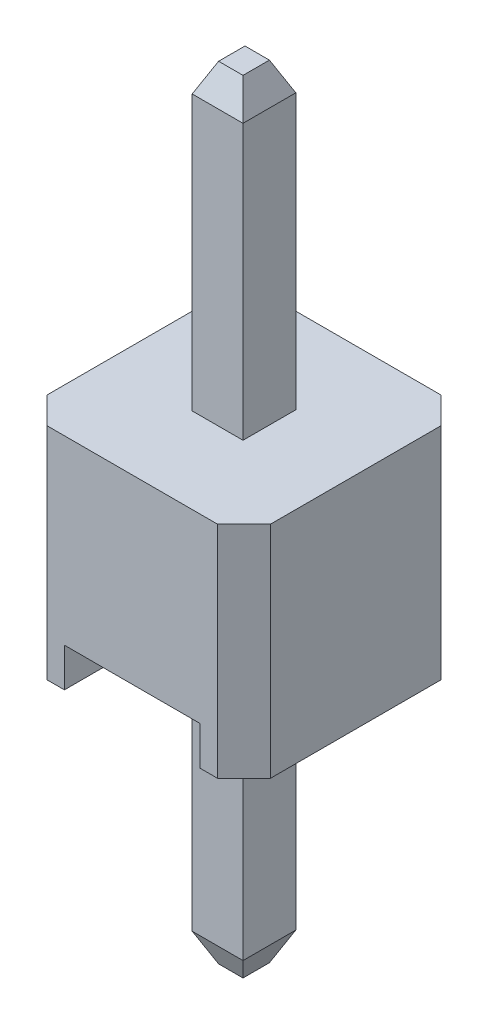
ISO-10303-21;
HEADER;
FILE_DESCRIPTION(('STEP AP214'),'2;1');
FILE_NAME('part.step','',(''),(''),'','','');
FILE_SCHEMA(('AUTOMOTIVE_DESIGN { 1 0 10303 214 1 1 1 1 }'));
ENDSEC;
DATA;
#1=APPLICATION_CONTEXT('core data for automotive mechanical design processes');
#2=APPLICATION_PROTOCOL_DEFINITION('international standard','automotive_design',2000,#1);
#3=PRODUCT_CONTEXT('',#1,'mechanical');
#4=PRODUCT('Part','Part','',(#3));
#5=PRODUCT_RELATED_PRODUCT_CATEGORY('part','',(#4));
#6=PRODUCT_DEFINITION_FORMATION('','',#4);
#7=PRODUCT_DEFINITION_CONTEXT('part definition',#1,'design');
#8=PRODUCT_DEFINITION('design','',#6,#7);
#9=PRODUCT_DEFINITION_SHAPE('','',#8);
#10=(LENGTH_UNIT() NAMED_UNIT(*) SI_UNIT(.MILLI.,.METRE.));
#11=(NAMED_UNIT(*) PLANE_ANGLE_UNIT() SI_UNIT($,.RADIAN.));
#12=(NAMED_UNIT(*) SI_UNIT($,.STERADIAN.) SOLID_ANGLE_UNIT());
#13=UNCERTAINTY_MEASURE_WITH_UNIT(LENGTH_MEASURE(1.E-05),#10,'distance_accuracy_value','');
#14=(GEOMETRIC_REPRESENTATION_CONTEXT(3) GLOBAL_UNCERTAINTY_ASSIGNED_CONTEXT((#13)) GLOBAL_UNIT_ASSIGNED_CONTEXT((#10,
#11,#12)) REPRESENTATION_CONTEXT('',''));
#15=CARTESIAN_POINT('',(0.,0.,0.));
#16=DIRECTION('',(0.,0.,1.));
#17=DIRECTION('',(1.,0.,0.));
#18=AXIS2_PLACEMENT_3D('',#15,#16,#17);
#19=CARTESIAN_POINT('',(-0.970000000000004,0.,-1.27));
#20=DIRECTION('',(0.,1.,0.));
#21=DIRECTION('',(0.,0.,1.));
#22=AXIS2_PLACEMENT_3D('',#19,#20,#21);
#23=PLANE('',#22);
#24=DIRECTION('',(1.,0.,0.));
#25=VECTOR('',#24,1.);
#26=CARTESIAN_POINT('',(0.3,0.,0.));
#27=LINE('',#26,#25);
#28=CARTESIAN_POINT('',(2.04,0.,0.));
#29=VERTEX_POINT('',#28);
#30=CARTESIAN_POINT('',(2.24,0.,0.));
#31=VERTEX_POINT('',#30);
#32=EDGE_CURVE('E282',#29,#31,#27,.T.);
#33=ORIENTED_EDGE('',*,*,#32,.F.);
#34=DIRECTION('',(0.,0.,1.));
#35=VECTOR('',#34,1.);
#36=CARTESIAN_POINT('',(2.04,0.,0.));
#37=LINE('',#36,#35);
#38=CARTESIAN_POINT('',(2.04,0.,-2.54));
#39=VERTEX_POINT('',#38);
#40=EDGE_CURVE('E236',#39,#29,#37,.T.);
#41=ORIENTED_EDGE('',*,*,#40,.F.);
#42=DIRECTION('',(-1.,0.,0.));
#43=VECTOR('',#42,1.);
#44=CARTESIAN_POINT('',(2.24,0.,-2.54));
#45=LINE('',#44,#43);
#46=CARTESIAN_POINT('',(2.24,0.,-2.54));
#47=VERTEX_POINT('',#46);
#48=EDGE_CURVE('E261',#47,#39,#45,.T.);
#49=ORIENTED_EDGE('',*,*,#48,.F.);
#50=DIRECTION('',(-0.707106781186547,0.,-0.707106781186549));
#51=VECTOR('',#50,1.);
#52=CARTESIAN_POINT('',(2.54,0.,-2.24));
#53=LINE('',#52,#51);
#54=CARTESIAN_POINT('',(2.54,0.,-2.24));
#55=VERTEX_POINT('',#54);
#56=EDGE_CURVE('E290',#55,#47,#53,.T.);
#57=ORIENTED_EDGE('',*,*,#56,.F.);
#58=DIRECTION('',(0.,0.,-1.));
#59=VECTOR('',#58,1.);
#60=CARTESIAN_POINT('',(2.54,0.,-0.3));
#61=LINE('',#60,#59);
#62=CARTESIAN_POINT('',(2.54,0.,-0.3));
#63=VERTEX_POINT('',#62);
#64=EDGE_CURVE('E288',#63,#55,#61,.T.);
#65=ORIENTED_EDGE('',*,*,#64,.F.);
#66=DIRECTION('',(0.707106781186546,0.,-0.707106781186549));
#67=VECTOR('',#66,1.);
#68=CARTESIAN_POINT('',(2.24,0.,0.));
#69=LINE('',#68,#67);
#70=EDGE_CURVE('E286',#31,#63,#69,.T.);
#71=ORIENTED_EDGE('',*,*,#70,.F.);
#72=EDGE_LOOP('',(#33,#41,#49,#57,#65,#71));
#73=FACE_BOUND('',#72,.T.);
#74=ADVANCED_FACE('F32',(#73),#23,.F.);
#75=CARTESIAN_POINT('',(0.3,2.5,-2.54));
#76=DIRECTION('',(0.707106781186546,0.,0.707106781186549));
#77=DIRECTION('',(0.707106781186549,0.,-0.707106781186546));
#78=AXIS2_PLACEMENT_3D('',#75,#76,#77);
#79=PLANE('',#78);
#80=DIRECTION('',(-0.707106781186549,0.,0.707106781186546));
#81=VECTOR('',#80,1.);
#82=CARTESIAN_POINT('',(0.3,0.,-2.54));
#83=LINE('',#82,#81);
#84=CARTESIAN_POINT('',(0.3,0.,-2.54));
#85=VERTEX_POINT('',#84);
#86=CARTESIAN_POINT('',(0.,0.,-2.24));
#87=VERTEX_POINT('',#86);
#88=EDGE_CURVE('E250',#85,#87,#83,.T.);
#89=ORIENTED_EDGE('',*,*,#88,.T.);
#90=DIRECTION('',(0.,-1.,0.));
#91=VECTOR('',#90,1.);
#92=CARTESIAN_POINT('',(0.,2.5,-2.24));
#93=LINE('',#92,#91);
#94=CARTESIAN_POINT('',(0.,2.5,-2.24));
#95=VERTEX_POINT('',#94);
#96=EDGE_CURVE('E315',#95,#87,#93,.T.);
#97=ORIENTED_EDGE('',*,*,#96,.F.);
#98=DIRECTION('',(-0.707106781186549,0.,0.707106781186546));
#99=VECTOR('',#98,1.);
#100=CARTESIAN_POINT('',(0.3,2.5,-2.54));
#101=LINE('',#100,#99);
#102=CARTESIAN_POINT('',(0.3,2.5,-2.54));
#103=VERTEX_POINT('',#102);
#104=EDGE_CURVE('E257',#103,#95,#101,.T.);
#105=ORIENTED_EDGE('',*,*,#104,.F.);
#106=DIRECTION('',(0.,-1.,0.));
#107=VECTOR('',#106,1.);
#108=CARTESIAN_POINT('',(0.3,2.5,-2.54));
#109=LINE('',#108,#107);
#110=EDGE_CURVE('E275',#103,#85,#109,.T.);
#111=ORIENTED_EDGE('',*,*,#110,.T.);
#112=EDGE_LOOP('',(#89,#97,#105,#111));
#113=FACE_BOUND('',#112,.T.);
#114=ADVANCED_FACE('F447',(#113),#79,.F.);
#115=CARTESIAN_POINT('',(0.,2.5,-2.24));
#116=DIRECTION('',(1.,0.,0.));
#117=DIRECTION('',(0.,0.,-1.));
#118=AXIS2_PLACEMENT_3D('',#115,#116,#117);
#119=PLANE('',#118);
#120=DIRECTION('',(0.,0.,1.));
#121=VECTOR('',#120,1.);
#122=CARTESIAN_POINT('',(0.,0.,-2.24));
#123=LINE('',#122,#121);
#124=CARTESIAN_POINT('',(0.,0.,-0.299999999999999));
#125=VERTEX_POINT('',#124);
#126=EDGE_CURVE('E278',#87,#125,#123,.T.);
#127=ORIENTED_EDGE('',*,*,#126,.T.);
#128=DIRECTION('',(0.,-1.,0.));
#129=VECTOR('',#128,1.);
#130=CARTESIAN_POINT('',(0.,2.5,-0.299999999999999));
#131=LINE('',#130,#129);
#132=CARTESIAN_POINT('',(0.,2.5,-0.299999999999999));
#133=VERTEX_POINT('',#132);
#134=EDGE_CURVE('E312',#133,#125,#131,.T.);
#135=ORIENTED_EDGE('',*,*,#134,.F.);
#136=DIRECTION('',(0.,0.,1.));
#137=VECTOR('',#136,1.);
#138=CARTESIAN_POINT('',(0.,2.5,-2.24));
#139=LINE('',#138,#137);
#140=EDGE_CURVE('E260',#95,#133,#139,.T.);
#141=ORIENTED_EDGE('',*,*,#140,.F.);
#142=ORIENTED_EDGE('',*,*,#96,.T.);
#143=EDGE_LOOP('',(#127,#135,#141,#142));
#144=FACE_BOUND('',#143,.T.);
#145=ADVANCED_FACE('F454',(#144),#119,.F.);
#146=CARTESIAN_POINT('',(0.,2.5,-0.299999999999999));
#147=DIRECTION('',(0.707106781186546,0.,-0.707106781186549));
#148=DIRECTION('',(-0.707106781186549,0.,-0.707106781186546));
#149=AXIS2_PLACEMENT_3D('',#146,#147,#148);
#150=PLANE('',#149);
#151=DIRECTION('',(0.707106781186549,0.,0.707106781186546));
#152=VECTOR('',#151,1.);
#153=CARTESIAN_POINT('',(0.,0.,-0.299999999999999));
#154=LINE('',#153,#152);
#155=CARTESIAN_POINT('',(0.3,0.,0.));
#156=VERTEX_POINT('',#155);
#157=EDGE_CURVE('E280',#125,#156,#154,.T.);
#158=ORIENTED_EDGE('',*,*,#157,.T.);
#159=DIRECTION('',(0.,-1.,0.));
#160=VECTOR('',#159,1.);
#161=CARTESIAN_POINT('',(0.3,2.5,0.));
#162=LINE('',#161,#160);
#163=CARTESIAN_POINT('',(0.3,2.5,0.));
#164=VERTEX_POINT('',#163);
#165=EDGE_CURVE('E309',#164,#156,#162,.T.);
#166=ORIENTED_EDGE('',*,*,#165,.F.);
#167=DIRECTION('',(0.707106781186549,0.,0.707106781186546));
#168=VECTOR('',#167,1.);
#169=CARTESIAN_POINT('',(0.,2.5,-0.299999999999999));
#170=LINE('',#169,#168);
#171=EDGE_CURVE('E263',#133,#164,#170,.T.);
#172=ORIENTED_EDGE('',*,*,#171,.F.);
#173=ORIENTED_EDGE('',*,*,#134,.T.);
#174=EDGE_LOOP('',(#158,#166,#172,#173));
#175=FACE_BOUND('',#174,.T.);
#176=ADVANCED_FACE('F544',(#175),#150,.F.);
#177=CARTESIAN_POINT('',(0.3,2.5,0.));
#178=DIRECTION('',(0.,0.,-1.));
#179=DIRECTION('',(-1.,0.,0.));
#180=AXIS2_PLACEMENT_3D('',#177,#178,#179);
#181=PLANE('',#180);
#182=DIRECTION('',(-1.,0.,0.));
#183=VECTOR('',#182,1.);
#184=CARTESIAN_POINT('',(0.5,0.44,0.));
#185=LINE('',#184,#183);
#186=CARTESIAN_POINT('',(2.04,0.44,0.));
#187=VERTEX_POINT('',#186);
#188=CARTESIAN_POINT('',(0.5,0.44,0.));
#189=VERTEX_POINT('',#188);
#190=EDGE_CURVE('E232',#187,#189,#185,.T.);
#191=ORIENTED_EDGE('',*,*,#190,.F.);
#192=DIRECTION('',(0.,-1.,0.));
#193=VECTOR('',#192,1.);
#194=CARTESIAN_POINT('',(2.04,0.44,0.));
#195=LINE('',#194,#193);
#196=EDGE_CURVE('E247',#187,#29,#195,.T.);
#197=ORIENTED_EDGE('',*,*,#196,.T.);
#198=ORIENTED_EDGE('',*,*,#32,.T.);
#199=DIRECTION('',(0.,-1.,0.));
#200=VECTOR('',#199,1.);
#201=CARTESIAN_POINT('',(2.24,2.5,0.));
#202=LINE('',#201,#200);
#203=CARTESIAN_POINT('',(2.24,2.5,0.));
#204=VERTEX_POINT('',#203);
#205=EDGE_CURVE('E306',#204,#31,#202,.T.);
#206=ORIENTED_EDGE('',*,*,#205,.F.);
#207=DIRECTION('',(1.,0.,0.));
#208=VECTOR('',#207,1.);
#209=CARTESIAN_POINT('',(0.3,2.5,0.));
#210=LINE('',#209,#208);
#211=EDGE_CURVE('E265',#164,#204,#210,.T.);
#212=ORIENTED_EDGE('',*,*,#211,.F.);
#213=ORIENTED_EDGE('',*,*,#165,.T.);
#214=CARTESIAN_POINT('',(0.5,0.,0.));
#215=VERTEX_POINT('',#214);
#216=EDGE_CURVE('E283',#156,#215,#27,.T.);
#217=ORIENTED_EDGE('',*,*,#216,.T.);
#218=DIRECTION('',(0.,-1.,0.));
#219=VECTOR('',#218,1.);
#220=CARTESIAN_POINT('',(0.5,0.44,0.));
#221=LINE('',#220,#219);
#222=EDGE_CURVE('E244',#189,#215,#221,.T.);
#223=ORIENTED_EDGE('',*,*,#222,.F.);
#224=EDGE_LOOP('',(#191,#197,#198,#206,#212,#213,#217,#223));
#225=FACE_BOUND('',#224,.T.);
#226=ADVANCED_FACE('F494',(#225),#181,.F.);
#227=CARTESIAN_POINT('',(2.24,2.5,0.));
#228=DIRECTION('',(-0.707106781186549,0.,-0.707106781186546));
#229=DIRECTION('',(-0.707106781186546,0.,0.707106781186549));
#230=AXIS2_PLACEMENT_3D('',#227,#228,#229);
#231=PLANE('',#230);
#232=ORIENTED_EDGE('',*,*,#70,.T.);
#233=DIRECTION('',(0.,-1.,0.));
#234=VECTOR('',#233,1.);
#235=CARTESIAN_POINT('',(2.54,2.5,-0.3));
#236=LINE('',#235,#234);
#237=CARTESIAN_POINT('',(2.54,2.5,-0.3));
#238=VERTEX_POINT('',#237);
#239=EDGE_CURVE('E303',#238,#63,#236,.T.);
#240=ORIENTED_EDGE('',*,*,#239,.F.);
#241=DIRECTION('',(0.707106781186546,0.,-0.707106781186549));
#242=VECTOR('',#241,1.);
#243=CARTESIAN_POINT('',(2.24,2.5,0.));
#244=LINE('',#243,#242);
#245=EDGE_CURVE('E267',#204,#238,#244,.T.);
#246=ORIENTED_EDGE('',*,*,#245,.F.);
#247=ORIENTED_EDGE('',*,*,#205,.T.);
#248=EDGE_LOOP('',(#232,#240,#246,#247));
#249=FACE_BOUND('',#248,.T.);
#250=ADVANCED_FACE('F551',(#249),#231,.F.);
#251=CARTESIAN_POINT('',(2.54,2.5,-0.3));
#252=DIRECTION('',(-1.,0.,0.));
#253=DIRECTION('',(0.,0.,1.));
#254=AXIS2_PLACEMENT_3D('',#251,#252,#253);
#255=PLANE('',#254);
#256=ORIENTED_EDGE('',*,*,#64,.T.);
#257=DIRECTION('',(0.,-1.,0.));
#258=VECTOR('',#257,1.);
#259=CARTESIAN_POINT('',(2.54,2.5,-2.24));
#260=LINE('',#259,#258);
#261=CARTESIAN_POINT('',(2.54,2.5,-2.24));
#262=VERTEX_POINT('',#261);
#263=EDGE_CURVE('E300',#262,#55,#260,.T.);
#264=ORIENTED_EDGE('',*,*,#263,.F.);
#265=DIRECTION('',(0.,0.,-1.));
#266=VECTOR('',#265,1.);
#267=CARTESIAN_POINT('',(2.54,2.5,-0.3));
#268=LINE('',#267,#266);
#269=EDGE_CURVE('E269',#238,#262,#268,.T.);
#270=ORIENTED_EDGE('',*,*,#269,.F.);
#271=ORIENTED_EDGE('',*,*,#239,.T.);
#272=EDGE_LOOP('',(#256,#264,#270,#271));
#273=FACE_BOUND('',#272,.T.);
#274=ADVANCED_FACE('F554',(#273),#255,.F.);
#275=CARTESIAN_POINT('',(2.54,2.5,-2.24));
#276=DIRECTION('',(-0.707106781186549,0.,0.707106781186547));
#277=DIRECTION('',(0.707106781186547,0.,0.707106781186549));
#278=AXIS2_PLACEMENT_3D('',#275,#276,#277);
#279=PLANE('',#278);
#280=ORIENTED_EDGE('',*,*,#56,.T.);
#281=DIRECTION('',(0.,-1.,0.));
#282=VECTOR('',#281,1.);
#283=CARTESIAN_POINT('',(2.24,2.5,-2.54));
#284=LINE('',#283,#282);
#285=CARTESIAN_POINT('',(2.24,2.5,-2.54));
#286=VERTEX_POINT('',#285);
#287=EDGE_CURVE('E297',#286,#47,#284,.T.);
#288=ORIENTED_EDGE('',*,*,#287,.F.);
#289=DIRECTION('',(-0.707106781186547,0.,-0.707106781186549));
#290=VECTOR('',#289,1.);
#291=CARTESIAN_POINT('',(2.54,2.5,-2.24));
#292=LINE('',#291,#290);
#293=EDGE_CURVE('E271',#262,#286,#292,.T.);
#294=ORIENTED_EDGE('',*,*,#293,.F.);
#295=ORIENTED_EDGE('',*,*,#263,.T.);
#296=EDGE_LOOP('',(#280,#288,#294,#295));
#297=FACE_BOUND('',#296,.T.);
#298=ADVANCED_FACE('F558',(#297),#279,.F.);
#299=CARTESIAN_POINT('',(2.24,2.5,-2.54));
#300=DIRECTION('',(0.,0.,1.));
#301=DIRECTION('',(1.,0.,0.));
#302=AXIS2_PLACEMENT_3D('',#299,#300,#301);
#303=PLANE('',#302);
#304=ORIENTED_EDGE('',*,*,#48,.T.);
#305=DIRECTION('',(0.,-1.,0.));
#306=VECTOR('',#305,1.);
#307=CARTESIAN_POINT('',(2.04,0.44,-2.54));
#308=LINE('',#307,#306);
#309=CARTESIAN_POINT('',(2.04,0.44,-2.54));
#310=VERTEX_POINT('',#309);
#311=EDGE_CURVE('E251',#310,#39,#308,.T.);
#312=ORIENTED_EDGE('',*,*,#311,.F.);
#313=DIRECTION('',(1.,0.,0.));
#314=VECTOR('',#313,1.);
#315=CARTESIAN_POINT('',(0.5,0.44,-2.54));
#316=LINE('',#315,#314);
#317=CARTESIAN_POINT('',(0.5,0.44,-2.54));
#318=VERTEX_POINT('',#317);
#319=EDGE_CURVE('E239',#318,#310,#316,.T.);
#320=ORIENTED_EDGE('',*,*,#319,.F.);
#321=DIRECTION('',(0.,-1.,0.));
#322=VECTOR('',#321,1.);
#323=CARTESIAN_POINT('',(0.5,0.44,-2.54));
#324=LINE('',#323,#322);
#325=CARTESIAN_POINT('',(0.5,0.,-2.54));
#326=VERTEX_POINT('',#325);
#327=EDGE_CURVE('E253',#318,#326,#324,.T.);
#328=ORIENTED_EDGE('',*,*,#327,.T.);
#329=EDGE_CURVE('E292',#326,#85,#45,.T.);
#330=ORIENTED_EDGE('',*,*,#329,.T.);
#331=ORIENTED_EDGE('',*,*,#110,.F.);
#332=DIRECTION('',(-1.,0.,0.));
#333=VECTOR('',#332,1.);
#334=CARTESIAN_POINT('',(2.24,2.5,-2.54));
#335=LINE('',#334,#333);
#336=EDGE_CURVE('E273',#286,#103,#335,.T.);
#337=ORIENTED_EDGE('',*,*,#336,.F.);
#338=ORIENTED_EDGE('',*,*,#287,.T.);
#339=EDGE_LOOP('',(#304,#312,#320,#328,#330,#331,#337,#338));
#340=FACE_BOUND('',#339,.T.);
#341=ADVANCED_FACE('F470',(#340),#303,.F.);
#342=CARTESIAN_POINT('',(-0.970000000000004,2.5,-1.27));
#343=DIRECTION('',(0.,1.,0.));
#344=DIRECTION('',(0.,0.,1.));
#345=AXIS2_PLACEMENT_3D('',#342,#343,#344);
#346=PLANE('',#345);
#347=DIRECTION('',(0.,0.,1.));
#348=VECTOR('',#347,1.);
#349=CARTESIAN_POINT('',(0.981246934946046,2.5,-1.27));
#350=LINE('',#349,#348);
#351=CARTESIAN_POINT('',(0.981246934946046,2.5,-1.57));
#352=VERTEX_POINT('',#351);
#353=CARTESIAN_POINT('',(0.981246934946046,2.5,-0.97));
#354=VERTEX_POINT('',#353);
#355=EDGE_CURVE('E229',#352,#354,#350,.T.);
#356=ORIENTED_EDGE('',*,*,#355,.F.);
#357=DIRECTION('',(-1.,0.,0.));
#358=VECTOR('',#357,1.);
#359=CARTESIAN_POINT('',(-0.970000000000004,2.5,-1.57));
#360=LINE('',#359,#358);
#361=CARTESIAN_POINT('',(1.55875306505396,2.5,-1.57));
#362=VERTEX_POINT('',#361);
#363=EDGE_CURVE('E200',#362,#352,#360,.T.);
#364=ORIENTED_EDGE('',*,*,#363,.F.);
#365=DIRECTION('',(0.,0.,-1.));
#366=VECTOR('',#365,1.);
#367=CARTESIAN_POINT('',(1.55875306505396,2.5,-1.27));
#368=LINE('',#367,#366);
#369=CARTESIAN_POINT('',(1.55875306505396,2.5,-0.97));
#370=VERTEX_POINT('',#369);
#371=EDGE_CURVE('E193',#370,#362,#368,.T.);
#372=ORIENTED_EDGE('',*,*,#371,.F.);
#373=DIRECTION('',(1.,0.,0.));
#374=VECTOR('',#373,1.);
#375=CARTESIAN_POINT('',(-0.970000000000004,2.5,-0.969999999999999));
#376=LINE('',#375,#374);
#377=EDGE_CURVE('E197',#354,#370,#376,.T.);
#378=ORIENTED_EDGE('',*,*,#377,.F.);
#379=EDGE_LOOP('',(#356,#364,#372,#378));
#380=FACE_BOUND('',#379,.T.);
#381=ORIENTED_EDGE('',*,*,#104,.T.);
#382=ORIENTED_EDGE('',*,*,#140,.T.);
#383=ORIENTED_EDGE('',*,*,#171,.T.);
#384=ORIENTED_EDGE('',*,*,#211,.T.);
#385=ORIENTED_EDGE('',*,*,#245,.T.);
#386=ORIENTED_EDGE('',*,*,#269,.T.);
#387=ORIENTED_EDGE('',*,*,#293,.T.);
#388=ORIENTED_EDGE('',*,*,#336,.T.);
#389=EDGE_LOOP('',(#381,#382,#383,#384,#385,#386,#387,#388));
#390=FACE_BOUND('',#389,.T.);
#391=ADVANCED_FACE('F195',(#380,#390),#346,.T.);
#392=ORIENTED_EDGE('',*,*,#329,.F.);
#393=DIRECTION('',(0.,0.,-1.));
#394=VECTOR('',#393,1.);
#395=CARTESIAN_POINT('',(0.5,0.,0.));
#396=LINE('',#395,#394);
#397=EDGE_CURVE('E231',#215,#326,#396,.T.);
#398=ORIENTED_EDGE('',*,*,#397,.F.);
#399=ORIENTED_EDGE('',*,*,#216,.F.);
#400=ORIENTED_EDGE('',*,*,#157,.F.);
#401=ORIENTED_EDGE('',*,*,#126,.F.);
#402=ORIENTED_EDGE('',*,*,#88,.F.);
#403=EDGE_LOOP('',(#392,#398,#399,#400,#401,#402));
#404=FACE_BOUND('',#403,.T.);
#405=ADVANCED_FACE('F450',(#404),#23,.F.);
#406=CARTESIAN_POINT('',(2.04,0.44,0.));
#407=DIRECTION('',(1.,0.,0.));
#408=DIRECTION('',(0.,0.,-1.));
#409=AXIS2_PLACEMENT_3D('',#406,#407,#408);
#410=PLANE('',#409);
#411=ORIENTED_EDGE('',*,*,#40,.T.);
#412=ORIENTED_EDGE('',*,*,#196,.F.);
#413=DIRECTION('',(0.,0.,1.));
#414=VECTOR('',#413,1.);
#415=CARTESIAN_POINT('',(2.04,0.44,0.));
#416=LINE('',#415,#414);
#417=EDGE_CURVE('E241',#310,#187,#416,.T.);
#418=ORIENTED_EDGE('',*,*,#417,.F.);
#419=ORIENTED_EDGE('',*,*,#311,.T.);
#420=EDGE_LOOP('',(#411,#412,#418,#419));
#421=FACE_BOUND('',#420,.T.);
#422=ADVANCED_FACE('F461',(#421),#410,.F.);
#423=CARTESIAN_POINT('',(0.5,0.44,0.));
#424=DIRECTION('',(-1.,0.,0.));
#425=DIRECTION('',(0.,0.,1.));
#426=AXIS2_PLACEMENT_3D('',#423,#424,#425);
#427=PLANE('',#426);
#428=ORIENTED_EDGE('',*,*,#397,.T.);
#429=ORIENTED_EDGE('',*,*,#327,.F.);
#430=DIRECTION('',(0.,0.,-1.));
#431=VECTOR('',#430,1.);
#432=CARTESIAN_POINT('',(0.5,0.44,0.));
#433=LINE('',#432,#431);
#434=EDGE_CURVE('E235',#189,#318,#433,.T.);
#435=ORIENTED_EDGE('',*,*,#434,.F.);
#436=ORIENTED_EDGE('',*,*,#222,.T.);
#437=EDGE_LOOP('',(#428,#429,#435,#436));
#438=FACE_BOUND('',#437,.T.);
#439=ADVANCED_FACE('F467',(#438),#427,.F.);
#440=CARTESIAN_POINT('',(2.04,0.44,0.));
#441=DIRECTION('',(0.,1.,0.));
#442=DIRECTION('',(0.,0.,1.));
#443=AXIS2_PLACEMENT_3D('',#440,#441,#442);
#444=PLANE('',#443);
#445=DIRECTION('',(-1.,0.,0.));
#446=VECTOR('',#445,1.);
#447=CARTESIAN_POINT('',(2.04,0.44,-1.57));
#448=LINE('',#447,#446);
#449=CARTESIAN_POINT('',(1.55875306505395,0.44,-1.57));
#450=VERTEX_POINT('',#449);
#451=CARTESIAN_POINT('',(0.981246934946046,0.44,-1.57));
#452=VERTEX_POINT('',#451);
#453=EDGE_CURVE('E324',#450,#452,#448,.T.);
#454=ORIENTED_EDGE('',*,*,#453,.T.);
#455=DIRECTION('',(0.,0.,1.));
#456=VECTOR('',#455,1.);
#457=CARTESIAN_POINT('',(0.981246934946047,0.44,0.));
#458=LINE('',#457,#456);
#459=CARTESIAN_POINT('',(0.981246934946046,0.44,-0.97));
#460=VERTEX_POINT('',#459);
#461=EDGE_CURVE('E327',#452,#460,#458,.T.);
#462=ORIENTED_EDGE('',*,*,#461,.T.);
#463=DIRECTION('',(1.,0.,0.));
#464=VECTOR('',#463,1.);
#465=CARTESIAN_POINT('',(2.04,0.44,-0.97));
#466=LINE('',#465,#464);
#467=CARTESIAN_POINT('',(1.55875306505396,0.44,-0.97));
#468=VERTEX_POINT('',#467);
#469=EDGE_CURVE('E318',#460,#468,#466,.T.);
#470=ORIENTED_EDGE('',*,*,#469,.T.);
#471=DIRECTION('',(0.,0.,-1.));
#472=VECTOR('',#471,1.);
#473=CARTESIAN_POINT('',(1.55875306505396,0.44,0.));
#474=LINE('',#473,#472);
#475=EDGE_CURVE('E321',#468,#450,#474,.T.);
#476=ORIENTED_EDGE('',*,*,#475,.T.);
#477=EDGE_LOOP('',(#454,#462,#470,#476));
#478=FACE_BOUND('',#477,.T.);
#479=ORIENTED_EDGE('',*,*,#190,.T.);
#480=ORIENTED_EDGE('',*,*,#434,.T.);
#481=ORIENTED_EDGE('',*,*,#319,.T.);
#482=ORIENTED_EDGE('',*,*,#417,.T.);
#483=EDGE_LOOP('',(#479,#480,#481,#482));
#484=FACE_BOUND('',#483,.T.);
#485=ADVANCED_FACE('F404',(#478,#484),#444,.F.);
#486=CARTESIAN_POINT('',(0.981246934946046,-2.94,-1.57));
#487=DIRECTION('',(0.,-1.,0.));
#488=DIRECTION('',(0.,0.,-1.));
#489=AXIS2_PLACEMENT_3D('',#486,#487,#488);
#490=PLANE('',#489);
#491=DIRECTION('',(0.,0.,1.));
#492=VECTOR('',#491,1.);
#493=CARTESIAN_POINT('',(1.40875306505396,-2.94,-1.57));
#494=LINE('',#493,#492);
#495=CARTESIAN_POINT('',(1.40875306505396,-2.94,-1.42));
#496=VERTEX_POINT('',#495);
#497=CARTESIAN_POINT('',(1.40875306505396,-2.94,-1.12));
#498=VERTEX_POINT('',#497);
#499=EDGE_CURVE('E364',#496,#498,#494,.T.);
#500=ORIENTED_EDGE('',*,*,#499,.T.);
#501=DIRECTION('',(-1.,0.,0.));
#502=VECTOR('',#501,1.);
#503=CARTESIAN_POINT('',(0.981246934946046,-2.94,-1.12));
#504=LINE('',#503,#502);
#505=CARTESIAN_POINT('',(1.13124693494605,-2.94,-1.12));
#506=VERTEX_POINT('',#505);
#507=EDGE_CURVE('E366',#498,#506,#504,.T.);
#508=ORIENTED_EDGE('',*,*,#507,.T.);
#509=DIRECTION('',(0.,0.,-1.));
#510=VECTOR('',#509,1.);
#511=CARTESIAN_POINT('',(1.13124693494605,-2.94,-1.57));
#512=LINE('',#511,#510);
#513=CARTESIAN_POINT('',(1.13124693494605,-2.94,-1.42));
#514=VERTEX_POINT('',#513);
#515=EDGE_CURVE('E360',#506,#514,#512,.T.);
#516=ORIENTED_EDGE('',*,*,#515,.T.);
#517=DIRECTION('',(1.,0.,0.));
#518=VECTOR('',#517,1.);
#519=CARTESIAN_POINT('',(0.981246934946046,-2.94,-1.42));
#520=LINE('',#519,#518);
#521=EDGE_CURVE('E362',#514,#496,#520,.T.);
#522=ORIENTED_EDGE('',*,*,#521,.T.);
#523=EDGE_LOOP('',(#500,#508,#516,#522));
#524=FACE_BOUND('',#523,.T.);
#525=ADVANCED_FACE('F389',(#524),#490,.T.);
#526=CARTESIAN_POINT('',(1.55875306505396,-2.94,-0.97));
#527=DIRECTION('',(0.,0.,1.));
#528=DIRECTION('',(1.,0.,0.));
#529=AXIS2_PLACEMENT_3D('',#526,#527,#528);
#530=PLANE('',#529);
#531=DIRECTION('',(0.,1.,0.));
#532=VECTOR('',#531,1.);
#533=CARTESIAN_POINT('',(0.981246934946046,-2.94,-0.97));
#534=LINE('',#533,#532);
#535=CARTESIAN_POINT('',(0.981246934946046,-2.61832396192357,-0.97));
#536=VERTEX_POINT('',#535);
#537=EDGE_CURVE('E220',#536,#460,#534,.T.);
#538=ORIENTED_EDGE('',*,*,#537,.F.);
#539=DIRECTION('',(1.,0.,0.));
#540=VECTOR('',#539,1.);
#541=CARTESIAN_POINT('',(1.55875306505396,-2.61832396192357,-0.97));
#542=LINE('',#541,#540);
#543=CARTESIAN_POINT('',(1.55875306505396,-2.61832396192357,-0.97));
#544=VERTEX_POINT('',#543);
#545=EDGE_CURVE('E347',#536,#544,#542,.T.);
#546=ORIENTED_EDGE('',*,*,#545,.T.);
#547=DIRECTION('',(0.,1.,0.));
#548=VECTOR('',#547,1.);
#549=CARTESIAN_POINT('',(1.55875306505396,-2.94,-0.97));
#550=LINE('',#549,#548);
#551=EDGE_CURVE('E219',#544,#468,#550,.T.);
#552=ORIENTED_EDGE('',*,*,#551,.T.);
#553=ORIENTED_EDGE('',*,*,#469,.F.);
#554=EDGE_LOOP('',(#538,#546,#552,#553));
#555=FACE_BOUND('',#554,.T.);
#556=ADVANCED_FACE('F398',(#555),#530,.T.);
#557=CARTESIAN_POINT('',(1.55875306505395,-2.94,-1.57));
#558=DIRECTION('',(1.,0.,0.));
#559=DIRECTION('',(0.,0.,-1.));
#560=AXIS2_PLACEMENT_3D('',#557,#558,#559);
#561=PLANE('',#560);
#562=ORIENTED_EDGE('',*,*,#551,.F.);
#563=DIRECTION('',(0.,0.,-1.));
#564=VECTOR('',#563,1.);
#565=CARTESIAN_POINT('',(1.55875306505395,-2.61832396192357,-1.57));
#566=LINE('',#565,#564);
#567=CARTESIAN_POINT('',(1.55875306505395,-2.61832396192357,-1.57));
#568=VERTEX_POINT('',#567);
#569=EDGE_CURVE('E56',#544,#568,#566,.T.);
#570=ORIENTED_EDGE('',*,*,#569,.T.);
#571=DIRECTION('',(0.,1.,0.));
#572=VECTOR('',#571,1.);
#573=CARTESIAN_POINT('',(1.55875306505395,-2.94,-1.57));
#574=LINE('',#573,#572);
#575=EDGE_CURVE('E225',#568,#450,#574,.T.);
#576=ORIENTED_EDGE('',*,*,#575,.T.);
#577=ORIENTED_EDGE('',*,*,#475,.F.);
#578=EDGE_LOOP('',(#562,#570,#576,#577));
#579=FACE_BOUND('',#578,.T.);
#580=ADVANCED_FACE('F401',(#579),#561,.T.);
#581=CARTESIAN_POINT('',(0.981246934946046,-2.94,-1.57));
#582=DIRECTION('',(0.,0.,-1.));
#583=DIRECTION('',(-1.,0.,0.));
#584=AXIS2_PLACEMENT_3D('',#581,#582,#583);
#585=PLANE('',#584);
#586=ORIENTED_EDGE('',*,*,#575,.F.);
#587=DIRECTION('',(-1.,0.,0.));
#588=VECTOR('',#587,1.);
#589=CARTESIAN_POINT('',(0.981246934946046,-2.61832396192357,-1.57));
#590=LINE('',#589,#588);
#591=CARTESIAN_POINT('',(0.981246934946046,-2.61832396192357,-1.57));
#592=VERTEX_POINT('',#591);
#593=EDGE_CURVE('E41',#568,#592,#590,.T.);
#594=ORIENTED_EDGE('',*,*,#593,.T.);
#595=DIRECTION('',(0.,1.,0.));
#596=VECTOR('',#595,1.);
#597=CARTESIAN_POINT('',(0.981246934946046,-2.94,-1.57));
#598=LINE('',#597,#596);
#599=EDGE_CURVE('E214',#592,#452,#598,.T.);
#600=ORIENTED_EDGE('',*,*,#599,.T.);
#601=ORIENTED_EDGE('',*,*,#453,.F.);
#602=EDGE_LOOP('',(#586,#594,#600,#601));
#603=FACE_BOUND('',#602,.T.);
#604=ADVANCED_FACE('F443',(#603),#585,.T.);
#605=CARTESIAN_POINT('',(0.981246934946046,-2.94,-0.97));
#606=DIRECTION('',(-1.,0.,0.));
#607=DIRECTION('',(0.,0.,1.));
#608=AXIS2_PLACEMENT_3D('',#605,#606,#607);
#609=PLANE('',#608);
#610=ORIENTED_EDGE('',*,*,#599,.F.);
#611=DIRECTION('',(0.,0.,1.));
#612=VECTOR('',#611,1.);
#613=CARTESIAN_POINT('',(0.981246934946046,-2.61832396192357,-0.97));
#614=LINE('',#613,#612);
#615=EDGE_CURVE('E11',#592,#536,#614,.T.);
#616=ORIENTED_EDGE('',*,*,#615,.T.);
#617=ORIENTED_EDGE('',*,*,#537,.T.);
#618=ORIENTED_EDGE('',*,*,#461,.F.);
#619=EDGE_LOOP('',(#610,#616,#617,#618));
#620=FACE_BOUND('',#619,.T.);
#621=ADVANCED_FACE('F408',(#620),#609,.T.);
#622=CARTESIAN_POINT('',(0.981246934946046,5.61832396192357,-0.97));
#623=VERTEX_POINT('',#622);
#624=EDGE_CURVE('E213',#354,#623,#534,.T.);
#625=ORIENTED_EDGE('',*,*,#624,.T.);
#626=DIRECTION('',(0.,0.,-1.));
#627=VECTOR('',#626,1.);
#628=CARTESIAN_POINT('',(0.981246934946046,5.61832396192357,-1.57));
#629=LINE('',#628,#627);
#630=CARTESIAN_POINT('',(0.981246934946046,5.61832396192357,-1.57));
#631=VERTEX_POINT('',#630);
#632=EDGE_CURVE('E345',#623,#631,#629,.T.);
#633=ORIENTED_EDGE('',*,*,#632,.T.);
#634=EDGE_CURVE('E409',#352,#631,#598,.T.);
#635=ORIENTED_EDGE('',*,*,#634,.F.);
#636=ORIENTED_EDGE('',*,*,#355,.T.);
#637=EDGE_LOOP('',(#625,#633,#635,#636));
#638=FACE_BOUND('',#637,.T.);
#639=ADVANCED_FACE('F435',(#638),#609,.T.);
#640=ORIENTED_EDGE('',*,*,#634,.T.);
#641=DIRECTION('',(1.,0.,0.));
#642=VECTOR('',#641,1.);
#643=CARTESIAN_POINT('',(1.55875306505395,5.61832396192357,-1.57));
#644=LINE('',#643,#642);
#645=CARTESIAN_POINT('',(1.55875306505395,5.61832396192357,-1.57));
#646=VERTEX_POINT('',#645);
#647=EDGE_CURVE('E339',#631,#646,#644,.T.);
#648=ORIENTED_EDGE('',*,*,#647,.T.);
#649=EDGE_CURVE('E222',#362,#646,#574,.T.);
#650=ORIENTED_EDGE('',*,*,#649,.F.);
#651=ORIENTED_EDGE('',*,*,#363,.T.);
#652=EDGE_LOOP('',(#640,#648,#650,#651));
#653=FACE_BOUND('',#652,.T.);
#654=ADVANCED_FACE('F414',(#653),#585,.T.);
#655=ORIENTED_EDGE('',*,*,#649,.T.);
#656=DIRECTION('',(0.,0.,1.));
#657=VECTOR('',#656,1.);
#658=CARTESIAN_POINT('',(1.55875306505396,5.61832396192357,-0.97));
#659=LINE('',#658,#657);
#660=CARTESIAN_POINT('',(1.55875306505396,5.61832396192357,-0.97));
#661=VERTEX_POINT('',#660);
#662=EDGE_CURVE('E218',#646,#661,#659,.T.);
#663=ORIENTED_EDGE('',*,*,#662,.T.);
#664=EDGE_CURVE('E210',#370,#661,#550,.T.);
#665=ORIENTED_EDGE('',*,*,#664,.F.);
#666=ORIENTED_EDGE('',*,*,#371,.T.);
#667=EDGE_LOOP('',(#655,#663,#665,#666));
#668=FACE_BOUND('',#667,.T.);
#669=ADVANCED_FACE('F216',(#668),#561,.T.);
#670=ORIENTED_EDGE('',*,*,#664,.T.);
#671=DIRECTION('',(-1.,0.,0.));
#672=VECTOR('',#671,1.);
#673=CARTESIAN_POINT('',(0.981246934946046,5.61832396192357,-0.97));
#674=LINE('',#673,#672);
#675=EDGE_CURVE('E343',#661,#623,#674,.T.);
#676=ORIENTED_EDGE('',*,*,#675,.T.);
#677=ORIENTED_EDGE('',*,*,#624,.F.);
#678=ORIENTED_EDGE('',*,*,#377,.T.);
#679=EDGE_LOOP('',(#670,#676,#677,#678));
#680=FACE_BOUND('',#679,.T.);
#681=ADVANCED_FACE('F209',(#680),#530,.T.);
#682=CARTESIAN_POINT('',(0.981246934946046,5.94,-1.57));
#683=DIRECTION('',(0.,-1.,0.));
#684=DIRECTION('',(0.,0.,-1.));
#685=AXIS2_PLACEMENT_3D('',#682,#683,#684);
#686=PLANE('',#685);
#687=DIRECTION('',(0.,0.,-1.));
#688=VECTOR('',#687,1.);
#689=CARTESIAN_POINT('',(1.40875306505396,5.94,-1.57));
#690=LINE('',#689,#688);
#691=CARTESIAN_POINT('',(1.40875306505396,5.94,-1.12));
#692=VERTEX_POINT('',#691);
#693=CARTESIAN_POINT('',(1.40875306505396,5.94,-1.42));
#694=VERTEX_POINT('',#693);
#695=EDGE_CURVE('E334',#692,#694,#690,.T.);
#696=ORIENTED_EDGE('',*,*,#695,.T.);
#697=DIRECTION('',(-1.,0.,0.));
#698=VECTOR('',#697,1.);
#699=CARTESIAN_POINT('',(0.981246934946046,5.94,-1.42));
#700=LINE('',#699,#698);
#701=CARTESIAN_POINT('',(1.13124693494605,5.94,-1.42));
#702=VERTEX_POINT('',#701);
#703=EDGE_CURVE('E336',#694,#702,#700,.T.);
#704=ORIENTED_EDGE('',*,*,#703,.T.);
#705=DIRECTION('',(0.,0.,1.));
#706=VECTOR('',#705,1.);
#707=CARTESIAN_POINT('',(1.13124693494605,5.94,-0.97));
#708=LINE('',#707,#706);
#709=CARTESIAN_POINT('',(1.13124693494605,5.94,-1.12));
#710=VERTEX_POINT('',#709);
#711=EDGE_CURVE('E330',#702,#710,#708,.T.);
#712=ORIENTED_EDGE('',*,*,#711,.T.);
#713=DIRECTION('',(1.,0.,0.));
#714=VECTOR('',#713,1.);
#715=CARTESIAN_POINT('',(1.55875306505396,5.94,-1.12));
#716=LINE('',#715,#714);
#717=EDGE_CURVE('E332',#710,#692,#716,.T.);
#718=ORIENTED_EDGE('',*,*,#717,.T.);
#719=EDGE_LOOP('',(#696,#704,#712,#718));
#720=FACE_BOUND('',#719,.T.);
#721=ADVANCED_FACE('F427',(#720),#686,.F.);
#722=CARTESIAN_POINT('',(0.981246934946046,5.94,-1.12));
#723=DIRECTION('',(0.,0.422618261740705,0.906307787036647));
#724=DIRECTION('',(0.,-0.906307787036647,0.422618261740705));
#725=AXIS2_PLACEMENT_3D('',#722,#723,#724);
#726=PLANE('',#725);
#727=DIRECTION('',(0.38928162063503,0.834817129478983,-0.38928162063503));
#728=VECTOR('',#727,1.);
#729=CARTESIAN_POINT('',(1.19944001601995,6.08624053429386,-1.18819308107391));
#730=LINE('',#729,#728);
#731=EDGE_CURVE('E352',#623,#710,#730,.T.);
#732=ORIENTED_EDGE('',*,*,#731,.F.);
#733=ORIENTED_EDGE('',*,*,#675,.F.);
#734=DIRECTION('',(-0.389281620635029,0.834817129478984,-0.38928162063503));
#735=VECTOR('',#734,1.);
#736=CARTESIAN_POINT('',(1.34396870907609,6.07893049973529,-1.18478435597787));
#737=LINE('',#736,#735);
#738=EDGE_CURVE('E355',#692,#661,#737,.F.);
#739=ORIENTED_EDGE('',*,*,#738,.F.);
#740=ORIENTED_EDGE('',*,*,#717,.F.);
#741=EDGE_LOOP('',(#732,#733,#739,#740));
#742=FACE_BOUND('',#741,.T.);
#743=ADVANCED_FACE('F433',(#742),#726,.T.);
#744=CARTESIAN_POINT('',(1.40875306505396,5.94,-1.57));
#745=DIRECTION('',(0.906307787036647,0.422618261740705,0.));
#746=DIRECTION('',(-0.422618261740705,0.906307787036647,0.));
#747=AXIS2_PLACEMENT_3D('',#744,#745,#746);
#748=PLANE('',#747);
#749=ORIENTED_EDGE('',*,*,#738,.T.);
#750=ORIENTED_EDGE('',*,*,#662,.F.);
#751=DIRECTION('',(-0.389281620635029,0.834817129478984,0.38928162063503));
#752=VECTOR('',#751,1.);
#753=CARTESIAN_POINT('',(1.43148409207859,5.89125315523538,-1.44273102702464));
#754=LINE('',#753,#752);
#755=EDGE_CURVE('E350',#694,#646,#754,.F.);
#756=ORIENTED_EDGE('',*,*,#755,.F.);
#757=ORIENTED_EDGE('',*,*,#695,.F.);
#758=EDGE_LOOP('',(#749,#750,#756,#757));
#759=FACE_BOUND('',#758,.T.);
#760=ADVANCED_FACE('F431',(#759),#748,.T.);
#761=CARTESIAN_POINT('',(1.13124693494605,5.94,-1.57));
#762=DIRECTION('',(-0.906307787036647,0.422618261740705,0.));
#763=DIRECTION('',(-0.422618261740705,-0.906307787036647,0.));
#764=AXIS2_PLACEMENT_3D('',#761,#762,#763);
#765=PLANE('',#764);
#766=ORIENTED_EDGE('',*,*,#731,.T.);
#767=ORIENTED_EDGE('',*,*,#711,.F.);
#768=DIRECTION('',(-0.38928162063503,-0.834817129478983,-0.38928162063503));
#769=VECTOR('',#768,1.);
#770=CARTESIAN_POINT('',(1.10851590792141,5.89125315523538,-1.44273102702464));
#771=LINE('',#770,#769);
#772=EDGE_CURVE('E348',#631,#702,#771,.F.);
#773=ORIENTED_EDGE('',*,*,#772,.F.);
#774=ORIENTED_EDGE('',*,*,#632,.F.);
#775=EDGE_LOOP('',(#766,#767,#773,#774));
#776=FACE_BOUND('',#775,.T.);
#777=ADVANCED_FACE('F423',(#776),#765,.T.);
#778=CARTESIAN_POINT('',(0.981246934946046,5.94,-1.42));
#779=DIRECTION('',(0.,0.422618261740705,-0.906307787036647));
#780=DIRECTION('',(0.,0.906307787036647,0.422618261740705));
#781=AXIS2_PLACEMENT_3D('',#778,#779,#780);
#782=PLANE('',#781);
#783=ORIENTED_EDGE('',*,*,#755,.T.);
#784=ORIENTED_EDGE('',*,*,#647,.F.);
#785=ORIENTED_EDGE('',*,*,#772,.T.);
#786=ORIENTED_EDGE('',*,*,#703,.F.);
#787=EDGE_LOOP('',(#783,#784,#785,#786));
#788=FACE_BOUND('',#787,.T.);
#789=ADVANCED_FACE('F417',(#788),#782,.T.);
#790=CARTESIAN_POINT('',(0.981246934946046,-2.61832396192357,-1.57));
#791=DIRECTION('',(0.,0.422618261740699,0.90630778703665));
#792=DIRECTION('',(0.,-0.90630778703665,0.422618261740699));
#793=AXIS2_PLACEMENT_3D('',#790,#791,#792);
#794=PLANE('',#793);
#795=DIRECTION('',(-0.389281620635024,-0.834817129478988,0.389281620635025));
#796=VECTOR('',#795,1.);
#797=CARTESIAN_POINT('',(1.47123768205145,-2.80600130642347,-1.4824846169975));
#798=LINE('',#797,#796);
#799=EDGE_CURVE('E374',#496,#568,#798,.F.);
#800=ORIENTED_EDGE('',*,*,#799,.F.);
#801=ORIENTED_EDGE('',*,*,#521,.F.);
#802=DIRECTION('',(0.389281620635025,-0.834817129478988,0.389281620635024));
#803=VECTOR('',#802,1.);
#804=CARTESIAN_POINT('',(1.07217104304458,-2.81331134098204,-1.47907589190146));
#805=LINE('',#804,#803);
#806=EDGE_CURVE('E36',#592,#514,#805,.T.);
#807=ORIENTED_EDGE('',*,*,#806,.F.);
#808=ORIENTED_EDGE('',*,*,#593,.F.);
#809=EDGE_LOOP('',(#800,#801,#807,#808));
#810=FACE_BOUND('',#809,.T.);
#811=ADVANCED_FACE('F34',(#810),#794,.F.);
#812=CARTESIAN_POINT('',(0.981246934946046,-2.61832396192357,-0.97));
#813=DIRECTION('',(0.90630778703665,0.422618261740699,0.));
#814=DIRECTION('',(-0.422618261740699,0.90630778703665,0.));
#815=AXIS2_PLACEMENT_3D('',#812,#813,#814);
#816=PLANE('',#815);
#817=ORIENTED_EDGE('',*,*,#806,.T.);
#818=ORIENTED_EDGE('',*,*,#515,.F.);
#819=DIRECTION('',(-0.389281620635024,0.834817129478988,0.389281620635025));
#820=VECTOR('',#819,1.);
#821=CARTESIAN_POINT('',(0.981246934946046,-2.61832396192357,-0.97));
#822=LINE('',#821,#820);
#823=EDGE_CURVE('E373',#536,#506,#822,.F.);
#824=ORIENTED_EDGE('',*,*,#823,.F.);
#825=ORIENTED_EDGE('',*,*,#615,.F.);
#826=EDGE_LOOP('',(#817,#818,#824,#825));
#827=FACE_BOUND('',#826,.T.);
#828=ADVANCED_FACE('F384',(#827),#816,.F.);
#829=CARTESIAN_POINT('',(1.55875306505395,-2.61832396192357,-1.57));
#830=DIRECTION('',(-0.90630778703665,0.422618261740698,0.));
#831=DIRECTION('',(-0.422618261740698,-0.906307787036651,0.));
#832=AXIS2_PLACEMENT_3D('',#829,#830,#831);
#833=PLANE('',#832);
#834=ORIENTED_EDGE('',*,*,#799,.T.);
#835=ORIENTED_EDGE('',*,*,#569,.F.);
#836=DIRECTION('',(-0.389281620635024,-0.834817129478988,-0.389281620635025));
#837=VECTOR('',#836,1.);
#838=CARTESIAN_POINT('',(1.46782895695542,-2.81331134098204,-1.06092410809854));
#839=LINE('',#838,#837);
#840=EDGE_CURVE('E371',#498,#544,#839,.F.);
#841=ORIENTED_EDGE('',*,*,#840,.F.);
#842=ORIENTED_EDGE('',*,*,#499,.F.);
#843=EDGE_LOOP('',(#834,#835,#841,#842));
#844=FACE_BOUND('',#843,.T.);
#845=ADVANCED_FACE('F395',(#844),#833,.F.);
#846=CARTESIAN_POINT('',(1.55875306505396,-2.61832396192357,-0.97));
#847=DIRECTION('',(0.,0.422618261740699,-0.90630778703665));
#848=DIRECTION('',(0.,0.90630778703665,0.422618261740699));
#849=AXIS2_PLACEMENT_3D('',#846,#847,#848);
#850=PLANE('',#849);
#851=ORIENTED_EDGE('',*,*,#823,.T.);
#852=ORIENTED_EDGE('',*,*,#507,.F.);
#853=ORIENTED_EDGE('',*,*,#840,.T.);
#854=ORIENTED_EDGE('',*,*,#545,.F.);
#855=EDGE_LOOP('',(#851,#852,#853,#854));
#856=FACE_BOUND('',#855,.T.);
#857=ADVANCED_FACE('F393',(#856),#850,.F.);
#858=CLOSED_SHELL('',(#74,#114,#145,#176,#226,#250,#274,#298,#341,#391,#405,#422,#439,#485,#525,
#556,#580,#604,#621,#639,#654,#669,#681,#721,#743,#760,#777,#789,#811,#828,#845,#857));
#859=MANIFOLD_SOLID_BREP('B2',#858);
#860=ADVANCED_BREP_SHAPE_REPRESENTATION('',(#18,#859),#14);
#861=SHAPE_DEFINITION_REPRESENTATION(#9,#860);
ENDSEC;
END-ISO-10303-21;
